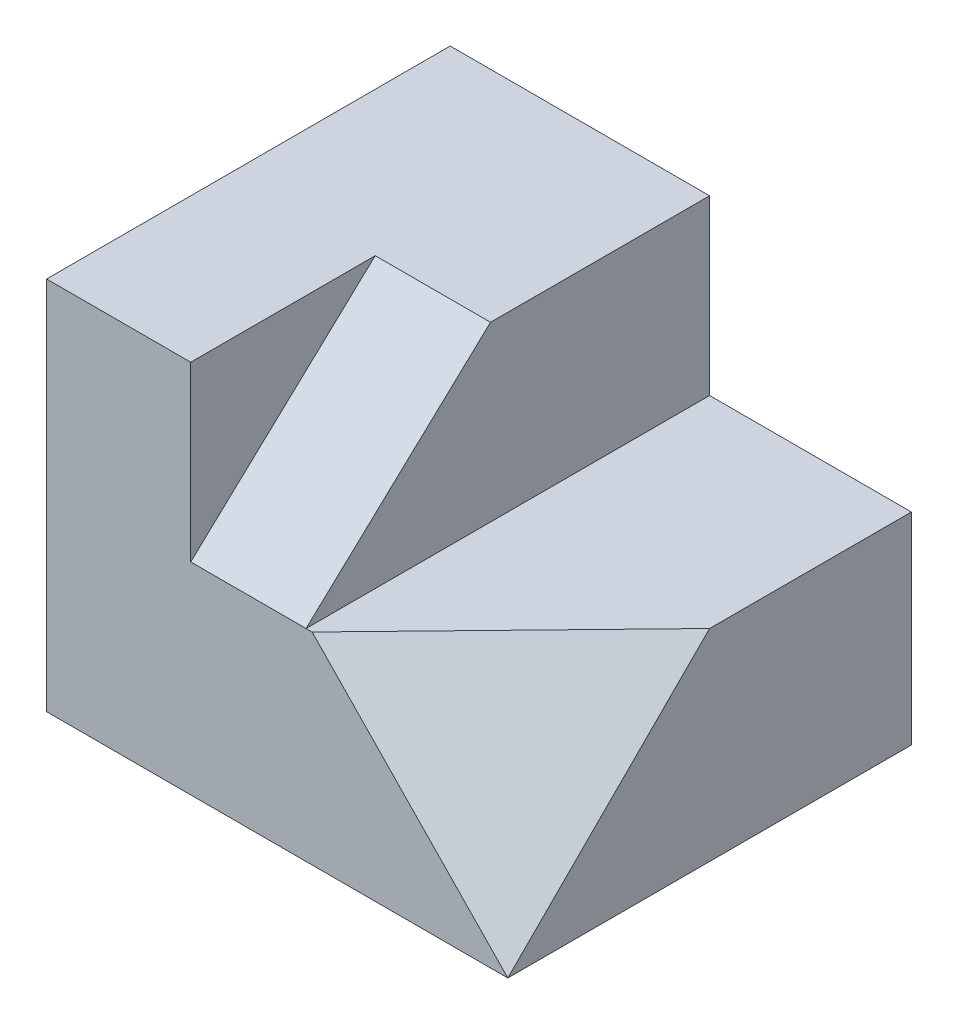
ISO-10303-21;
HEADER;
FILE_DESCRIPTION(('STEP AP214'),'2;1');
FILE_NAME('part.step','',(''),(''),'','','');
FILE_SCHEMA(('AUTOMOTIVE_DESIGN { 1 0 10303 214 1 1 1 1 }'));
ENDSEC;
DATA;
#1=APPLICATION_CONTEXT('core data for automotive mechanical design processes');
#2=APPLICATION_PROTOCOL_DEFINITION('international standard','automotive_design',2000,#1);
#3=PRODUCT_CONTEXT('',#1,'mechanical');
#4=PRODUCT('Part','Part','',(#3));
#5=PRODUCT_RELATED_PRODUCT_CATEGORY('part','',(#4));
#6=PRODUCT_DEFINITION_FORMATION('','',#4);
#7=PRODUCT_DEFINITION_CONTEXT('part definition',#1,'design');
#8=PRODUCT_DEFINITION('design','',#6,#7);
#9=PRODUCT_DEFINITION_SHAPE('','',#8);
#10=(LENGTH_UNIT() NAMED_UNIT(*) SI_UNIT(.MILLI.,.METRE.));
#11=(NAMED_UNIT(*) PLANE_ANGLE_UNIT() SI_UNIT($,.RADIAN.));
#12=(NAMED_UNIT(*) SI_UNIT($,.STERADIAN.) SOLID_ANGLE_UNIT());
#13=UNCERTAINTY_MEASURE_WITH_UNIT(LENGTH_MEASURE(1.E-05),#10,'distance_accuracy_value','');
#14=(GEOMETRIC_REPRESENTATION_CONTEXT(3) GLOBAL_UNCERTAINTY_ASSIGNED_CONTEXT((#13)) GLOBAL_UNIT_ASSIGNED_CONTEXT((#10,
#11,#12)) REPRESENTATION_CONTEXT('',''));
#15=CARTESIAN_POINT('',(0.,0.,0.));
#16=DIRECTION('',(0.,0.,1.));
#17=DIRECTION('',(1.,0.,0.));
#18=AXIS2_PLACEMENT_3D('',#15,#16,#17);
#19=CARTESIAN_POINT('',(0.,65.,0.));
#20=DIRECTION('',(0.,-1.,0.));
#21=DIRECTION('',(0.,0.,-1.));
#22=AXIS2_PLACEMENT_3D('',#19,#20,#21);
#23=PLANE('',#22);
#24=DIRECTION('',(0.,0.,1.));
#25=VECTOR('',#24,1.);
#26=CARTESIAN_POINT('',(25.,65.,-32.));
#27=LINE('',#26,#25);
#28=CARTESIAN_POINT('',(25.,65.,-32.));
#29=VERTEX_POINT('',#28);
#30=CARTESIAN_POINT('',(25.,65.,0.));
#31=VERTEX_POINT('',#30);
#32=EDGE_CURVE('E291',#29,#31,#27,.T.);
#33=ORIENTED_EDGE('',*,*,#32,.F.);
#34=DIRECTION('',(1.,0.,0.));
#35=VECTOR('',#34,1.);
#36=CARTESIAN_POINT('',(25.,65.,-32.));
#37=LINE('',#36,#35);
#38=CARTESIAN_POINT('',(45.,65.,-32.));
#39=VERTEX_POINT('',#38);
#40=EDGE_CURVE('E290',#29,#39,#37,.T.);
#41=ORIENTED_EDGE('',*,*,#40,.T.);
#42=DIRECTION('',(0.,0.,1.));
#43=VECTOR('',#42,1.);
#44=CARTESIAN_POINT('',(45.,65.,0.));
#45=LINE('',#44,#43);
#46=CARTESIAN_POINT('',(45.,65.,-70.));
#47=VERTEX_POINT('',#46);
#48=EDGE_CURVE('E167',#47,#39,#45,.T.);
#49=ORIENTED_EDGE('',*,*,#48,.F.);
#50=DIRECTION('',(-1.,0.,0.));
#51=VECTOR('',#50,1.);
#52=CARTESIAN_POINT('',(0.,65.,-70.));
#53=LINE('',#52,#51);
#54=CARTESIAN_POINT('',(0.,65.,-70.));
#55=VERTEX_POINT('',#54);
#56=EDGE_CURVE('E152',#47,#55,#53,.T.);
#57=ORIENTED_EDGE('',*,*,#56,.T.);
#58=DIRECTION('',(0.,0.,1.));
#59=VECTOR('',#58,1.);
#60=CARTESIAN_POINT('',(0.,65.,0.));
#61=LINE('',#60,#59);
#62=CARTESIAN_POINT('',(0.,65.,0.));
#63=VERTEX_POINT('',#62);
#64=EDGE_CURVE('E145',#55,#63,#61,.T.);
#65=ORIENTED_EDGE('',*,*,#64,.T.);
#66=DIRECTION('',(1.,0.,0.));
#67=VECTOR('',#66,1.);
#68=CARTESIAN_POINT('',(0.,65.,0.));
#69=LINE('',#68,#67);
#70=EDGE_CURVE('E175',#63,#31,#69,.T.);
#71=ORIENTED_EDGE('',*,*,#70,.T.);
#72=EDGE_LOOP('',(#33,#41,#49,#57,#65,#71));
#73=FACE_BOUND('',#72,.T.);
#74=ADVANCED_FACE('F45',(#73),#23,.F.);
#75=CARTESIAN_POINT('',(0.,65.,0.));
#76=DIRECTION('',(1.,0.,0.));
#77=DIRECTION('',(0.,0.,-1.));
#78=AXIS2_PLACEMENT_3D('',#75,#76,#77);
#79=PLANE('',#78);
#80=DIRECTION('',(0.,0.,1.));
#81=VECTOR('',#80,1.);
#82=CARTESIAN_POINT('',(0.,0.,0.));
#83=LINE('',#82,#81);
#84=CARTESIAN_POINT('',(0.,0.,-70.));
#85=VERTEX_POINT('',#84);
#86=CARTESIAN_POINT('',(0.,0.,0.));
#87=VERTEX_POINT('',#86);
#88=EDGE_CURVE('E138',#85,#87,#83,.T.);
#89=ORIENTED_EDGE('',*,*,#88,.T.);
#90=DIRECTION('',(0.,-1.,0.));
#91=VECTOR('',#90,1.);
#92=CARTESIAN_POINT('',(0.,65.,0.));
#93=LINE('',#92,#91);
#94=EDGE_CURVE('E11',#63,#87,#93,.T.);
#95=ORIENTED_EDGE('',*,*,#94,.F.);
#96=ORIENTED_EDGE('',*,*,#64,.F.);
#97=DIRECTION('',(0.,-1.,0.));
#98=VECTOR('',#97,1.);
#99=CARTESIAN_POINT('',(0.,65.,-70.));
#100=LINE('',#99,#98);
#101=EDGE_CURVE('E149',#55,#85,#100,.T.);
#102=ORIENTED_EDGE('',*,*,#101,.T.);
#103=EDGE_LOOP('',(#89,#95,#96,#102));
#104=FACE_BOUND('',#103,.T.);
#105=ADVANCED_FACE('F47',(#104),#79,.F.);
#106=CARTESIAN_POINT('',(0.,65.,0.));
#107=DIRECTION('',(0.,0.,-1.));
#108=DIRECTION('',(-1.,0.,0.));
#109=AXIS2_PLACEMENT_3D('',#106,#107,#108);
#110=PLANE('',#109);
#111=DIRECTION('',(1.,0.,0.));
#112=VECTOR('',#111,1.);
#113=CARTESIAN_POINT('',(0.,0.,0.));
#114=LINE('',#113,#112);
#115=CARTESIAN_POINT('',(80.,0.,0.));
#116=VERTEX_POINT('',#115);
#117=EDGE_CURVE('E131',#87,#116,#114,.T.);
#118=ORIENTED_EDGE('',*,*,#117,.T.);
#119=DIRECTION('',(0.696230281133055,-0.717818497695195,0.));
#120=VECTOR('',#119,1.);
#121=CARTESIAN_POINT('',(46.0526164790974,35.,0.));
#122=LINE('',#121,#120);
#123=CARTESIAN_POINT('',(46.0526164790974,35.,0.));
#124=VERTEX_POINT('',#123);
#125=EDGE_CURVE('E111',#124,#116,#122,.T.);
#126=ORIENTED_EDGE('',*,*,#125,.F.);
#127=DIRECTION('',(1.,0.,0.));
#128=VECTOR('',#127,1.);
#129=CARTESIAN_POINT('',(45.,35.,0.));
#130=LINE('',#129,#128);
#131=CARTESIAN_POINT('',(45.,35.,0.));
#132=VERTEX_POINT('',#131);
#133=EDGE_CURVE('E163',#132,#124,#130,.T.);
#134=ORIENTED_EDGE('',*,*,#133,.F.);
#135=DIRECTION('',(1.,0.,0.));
#136=VECTOR('',#135,1.);
#137=CARTESIAN_POINT('',(25.,35.,0.));
#138=LINE('',#137,#136);
#139=CARTESIAN_POINT('',(25.,35.,0.));
#140=VERTEX_POINT('',#139);
#141=EDGE_CURVE('E287',#140,#132,#138,.T.);
#142=ORIENTED_EDGE('',*,*,#141,.F.);
#143=DIRECTION('',(0.,-1.,0.));
#144=VECTOR('',#143,1.);
#145=CARTESIAN_POINT('',(25.,65.,0.));
#146=LINE('',#145,#144);
#147=EDGE_CURVE('E281',#31,#140,#146,.T.);
#148=ORIENTED_EDGE('',*,*,#147,.F.);
#149=ORIENTED_EDGE('',*,*,#70,.F.);
#150=ORIENTED_EDGE('',*,*,#94,.T.);
#151=EDGE_LOOP('',(#118,#126,#134,#142,#148,#149,#150));
#152=FACE_BOUND('',#151,.T.);
#153=ADVANCED_FACE('F132',(#152),#110,.F.);
#154=CARTESIAN_POINT('',(80.,65.,0.));
#155=DIRECTION('',(-1.,0.,0.));
#156=DIRECTION('',(0.,0.,1.));
#157=AXIS2_PLACEMENT_3D('',#154,#155,#156);
#158=PLANE('',#157);
#159=DIRECTION('',(0.,0.,-1.));
#160=VECTOR('',#159,1.);
#161=CARTESIAN_POINT('',(80.,35.,0.));
#162=LINE('',#161,#160);
#163=CARTESIAN_POINT('',(80.,35.,-34.9999999999999));
#164=VERTEX_POINT('',#163);
#165=CARTESIAN_POINT('',(80.,35.,-70.));
#166=VERTEX_POINT('',#165);
#167=EDGE_CURVE('E128',#164,#166,#162,.T.);
#168=ORIENTED_EDGE('',*,*,#167,.F.);
#169=DIRECTION('',(0.,0.707106781186548,-0.707106781186548));
#170=VECTOR('',#169,1.);
#171=CARTESIAN_POINT('',(80.,0.,0.));
#172=LINE('',#171,#170);
#173=EDGE_CURVE('E61',#116,#164,#172,.T.);
#174=ORIENTED_EDGE('',*,*,#173,.F.);
#175=DIRECTION('',(0.,0.,-1.));
#176=VECTOR('',#175,1.);
#177=CARTESIAN_POINT('',(80.,0.,0.));
#178=LINE('',#177,#176);
#179=CARTESIAN_POINT('',(80.,0.,-70.));
#180=VERTEX_POINT('',#179);
#181=EDGE_CURVE('E126',#116,#180,#178,.T.);
#182=ORIENTED_EDGE('',*,*,#181,.T.);
#183=DIRECTION('',(0.,-1.,0.));
#184=VECTOR('',#183,1.);
#185=CARTESIAN_POINT('',(80.,65.,-70.));
#186=LINE('',#185,#184);
#187=EDGE_CURVE('E54',#166,#180,#186,.T.);
#188=ORIENTED_EDGE('',*,*,#187,.F.);
#189=EDGE_LOOP('',(#168,#174,#182,#188));
#190=FACE_BOUND('',#189,.T.);
#191=ADVANCED_FACE('F123',(#190),#158,.F.);
#192=CARTESIAN_POINT('',(0.,65.,-70.));
#193=DIRECTION('',(0.,0.,1.));
#194=DIRECTION('',(1.,0.,0.));
#195=AXIS2_PLACEMENT_3D('',#192,#193,#194);
#196=PLANE('',#195);
#197=DIRECTION('',(0.,1.,0.));
#198=VECTOR('',#197,1.);
#199=CARTESIAN_POINT('',(45.,65.,-70.));
#200=LINE('',#199,#198);
#201=CARTESIAN_POINT('',(45.,35.,-70.));
#202=VERTEX_POINT('',#201);
#203=EDGE_CURVE('E69',#202,#47,#200,.T.);
#204=ORIENTED_EDGE('',*,*,#203,.F.);
#205=DIRECTION('',(1.,0.,0.));
#206=VECTOR('',#205,1.);
#207=CARTESIAN_POINT('',(45.,35.,-70.));
#208=LINE('',#207,#206);
#209=EDGE_CURVE('E158',#202,#166,#208,.T.);
#210=ORIENTED_EDGE('',*,*,#209,.T.);
#211=ORIENTED_EDGE('',*,*,#187,.T.);
#212=DIRECTION('',(-1.,0.,0.));
#213=VECTOR('',#212,1.);
#214=CARTESIAN_POINT('',(0.,0.,-70.));
#215=LINE('',#214,#213);
#216=EDGE_CURVE('E141',#180,#85,#215,.T.);
#217=ORIENTED_EDGE('',*,*,#216,.T.);
#218=ORIENTED_EDGE('',*,*,#101,.F.);
#219=ORIENTED_EDGE('',*,*,#56,.F.);
#220=EDGE_LOOP('',(#204,#210,#211,#217,#218,#219));
#221=FACE_BOUND('',#220,.T.);
#222=ADVANCED_FACE('F156',(#221),#196,.F.);
#223=CARTESIAN_POINT('',(0.,0.,0.));
#224=DIRECTION('',(0.,-1.,0.));
#225=DIRECTION('',(0.,0.,-1.));
#226=AXIS2_PLACEMENT_3D('',#223,#224,#225);
#227=PLANE('',#226);
#228=ORIENTED_EDGE('',*,*,#88,.F.);
#229=ORIENTED_EDGE('',*,*,#216,.F.);
#230=ORIENTED_EDGE('',*,*,#181,.F.);
#231=ORIENTED_EDGE('',*,*,#117,.F.);
#232=EDGE_LOOP('',(#228,#229,#230,#231));
#233=FACE_BOUND('',#232,.T.);
#234=ADVANCED_FACE('F140',(#233),#227,.T.);
#235=CARTESIAN_POINT('',(45.,35.,0.));
#236=DIRECTION('',(0.,-1.,0.));
#237=DIRECTION('',(0.,0.,-1.));
#238=AXIS2_PLACEMENT_3D('',#235,#236,#237);
#239=PLANE('',#238);
#240=ORIENTED_EDGE('',*,*,#133,.T.);
#241=DIRECTION('',(-0.696230281133055,0.,0.717818497695195));
#242=VECTOR('',#241,1.);
#243=CARTESIAN_POINT('',(80.,35.,-35.));
#244=LINE('',#243,#242);
#245=EDGE_CURVE('E113',#164,#124,#244,.T.);
#246=ORIENTED_EDGE('',*,*,#245,.F.);
#247=ORIENTED_EDGE('',*,*,#167,.T.);
#248=ORIENTED_EDGE('',*,*,#209,.F.);
#249=DIRECTION('',(0.,0.,-1.));
#250=VECTOR('',#249,1.);
#251=CARTESIAN_POINT('',(45.,35.,0.));
#252=LINE('',#251,#250);
#253=EDGE_CURVE('E279',#132,#202,#252,.T.);
#254=ORIENTED_EDGE('',*,*,#253,.F.);
#255=EDGE_LOOP('',(#240,#246,#247,#248,#254));
#256=FACE_BOUND('',#255,.T.);
#257=ADVANCED_FACE('F197',(#256),#239,.F.);
#258=CARTESIAN_POINT('',(45.,0.,0.));
#259=DIRECTION('',(1.,0.,0.));
#260=DIRECTION('',(0.,0.,-1.));
#261=AXIS2_PLACEMENT_3D('',#258,#259,#260);
#262=PLANE('',#261);
#263=DIRECTION('',(0.,0.68394112888133,-0.729537204140085));
#264=VECTOR('',#263,1.);
#265=CARTESIAN_POINT('',(45.,35.,0.));
#266=LINE('',#265,#264);
#267=EDGE_CURVE('E278',#132,#39,#266,.T.);
#268=ORIENTED_EDGE('',*,*,#267,.F.);
#269=ORIENTED_EDGE('',*,*,#253,.T.);
#270=ORIENTED_EDGE('',*,*,#203,.T.);
#271=ORIENTED_EDGE('',*,*,#48,.T.);
#272=EDGE_LOOP('',(#268,#269,#270,#271));
#273=FACE_BOUND('',#272,.T.);
#274=ADVANCED_FACE('F222',(#273),#262,.T.);
#275=CARTESIAN_POINT('',(25.,35.,0.));
#276=DIRECTION('',(0.,-0.729537204140085,-0.68394112888133));
#277=DIRECTION('',(0.,0.68394112888133,-0.729537204140085));
#278=AXIS2_PLACEMENT_3D('',#275,#276,#277);
#279=PLANE('',#278);
#280=ORIENTED_EDGE('',*,*,#267,.T.);
#281=ORIENTED_EDGE('',*,*,#40,.F.);
#282=DIRECTION('',(0.,0.68394112888133,-0.729537204140085));
#283=VECTOR('',#282,1.);
#284=CARTESIAN_POINT('',(25.,35.,0.));
#285=LINE('',#284,#283);
#286=EDGE_CURVE('E296',#140,#29,#285,.T.);
#287=ORIENTED_EDGE('',*,*,#286,.F.);
#288=ORIENTED_EDGE('',*,*,#141,.T.);
#289=EDGE_LOOP('',(#280,#281,#287,#288));
#290=FACE_BOUND('',#289,.T.);
#291=ADVANCED_FACE('F240',(#290),#279,.F.);
#292=CARTESIAN_POINT('',(25.,0.,0.));
#293=DIRECTION('',(-1.,0.,0.));
#294=DIRECTION('',(0.,0.,1.));
#295=AXIS2_PLACEMENT_3D('',#292,#293,#294);
#296=PLANE('',#295);
#297=ORIENTED_EDGE('',*,*,#147,.T.);
#298=ORIENTED_EDGE('',*,*,#286,.T.);
#299=ORIENTED_EDGE('',*,*,#32,.T.);
#300=EDGE_LOOP('',(#297,#298,#299));
#301=FACE_BOUND('',#300,.T.);
#302=ADVANCED_FACE('F229',(#301),#296,.F.);
#303=CARTESIAN_POINT('',(27.7632217926329,26.9282496562969,26.9282496562969));
#304=DIRECTION('',(-0.58910124122082,-0.57138416481037,-0.57138416481037));
#305=DIRECTION('',(-0.696230281133055,0.,0.717818497695195));
#306=AXIS2_PLACEMENT_3D('',#303,#304,#305);
#307=PLANE('',#306);
#308=ORIENTED_EDGE('',*,*,#125,.T.);
#309=ORIENTED_EDGE('',*,*,#173,.T.);
#310=ORIENTED_EDGE('',*,*,#245,.T.);
#311=EDGE_LOOP('',(#308,#309,#310));
#312=FACE_BOUND('',#311,.T.);
#313=ADVANCED_FACE('F112',(#312),#307,.F.);
#314=CLOSED_SHELL('',(#74,#105,#153,#191,#222,#234,#257,#274,#291,#302,#313));
#315=MANIFOLD_SOLID_BREP('B2',#314);
#316=ADVANCED_BREP_SHAPE_REPRESENTATION('',(#18,#315),#14);
#317=SHAPE_DEFINITION_REPRESENTATION(#9,#316);
ENDSEC;
END-ISO-10303-21;
